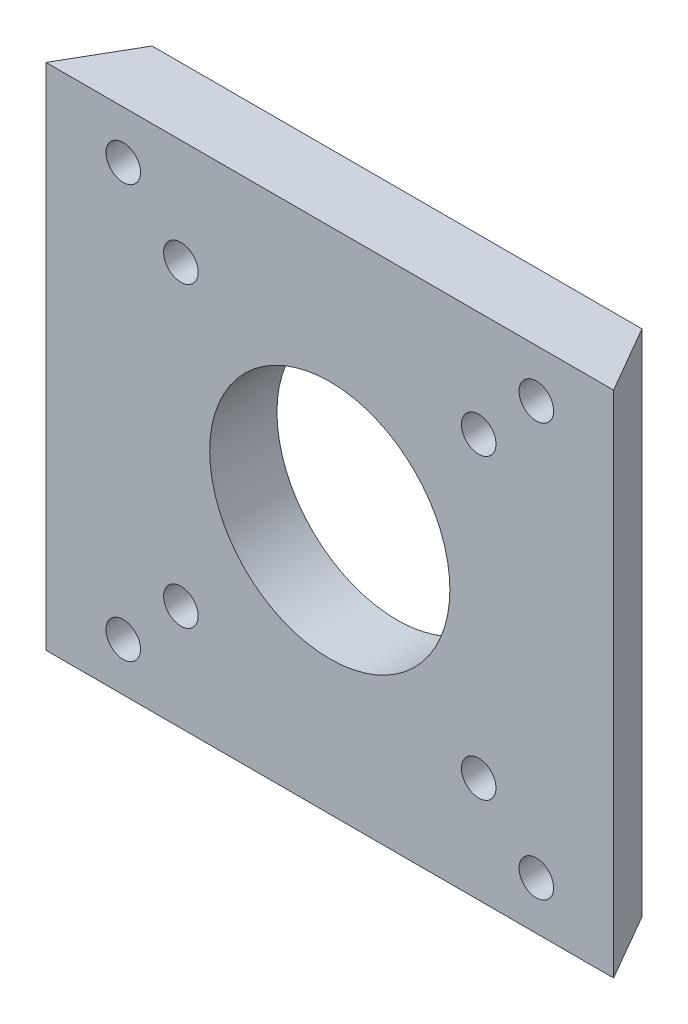
ISO-10303-21;
HEADER;
FILE_DESCRIPTION(('STEP AP214'),'2;1');
FILE_NAME('part.step','',(''),(''),'','','');
FILE_SCHEMA(('AUTOMOTIVE_DESIGN { 1 0 10303 214 1 1 1 1 }'));
ENDSEC;
DATA;
#1=APPLICATION_CONTEXT('core data for automotive mechanical design processes');
#2=APPLICATION_PROTOCOL_DEFINITION('international standard','automotive_design',2000,#1);
#3=PRODUCT_CONTEXT('',#1,'mechanical');
#4=PRODUCT('Part','Part','',(#3));
#5=PRODUCT_RELATED_PRODUCT_CATEGORY('part','',(#4));
#6=PRODUCT_DEFINITION_FORMATION('','',#4);
#7=PRODUCT_DEFINITION_CONTEXT('part definition',#1,'design');
#8=PRODUCT_DEFINITION('design','',#6,#7);
#9=PRODUCT_DEFINITION_SHAPE('','',#8);
#10=(LENGTH_UNIT() NAMED_UNIT(*) SI_UNIT(.MILLI.,.METRE.));
#11=(NAMED_UNIT(*) PLANE_ANGLE_UNIT() SI_UNIT($,.RADIAN.));
#12=(NAMED_UNIT(*) SI_UNIT($,.STERADIAN.) SOLID_ANGLE_UNIT());
#13=UNCERTAINTY_MEASURE_WITH_UNIT(LENGTH_MEASURE(1.E-05),#10,'distance_accuracy_value','');
#14=(GEOMETRIC_REPRESENTATION_CONTEXT(3) GLOBAL_UNCERTAINTY_ASSIGNED_CONTEXT((#13)) GLOBAL_UNIT_ASSIGNED_CONTEXT((#10,
#11,#12)) REPRESENTATION_CONTEXT('',''));
#15=CARTESIAN_POINT('',(0.,0.,0.));
#16=DIRECTION('',(0.,0.,1.));
#17=DIRECTION('',(1.,0.,0.));
#18=AXIS2_PLACEMENT_3D('',#15,#16,#17);
#19=CARTESIAN_POINT('',(-15.5,15.5,-3.));
#20=DIRECTION('',(0.,0.,1.));
#21=DIRECTION('',(1.,0.,0.));
#22=AXIS2_PLACEMENT_3D('',#19,#20,#21);
#23=CYLINDRICAL_SURFACE('',#22,1.8);
#24=CARTESIAN_POINT('',(-15.5,15.5,7.));
#25=DIRECTION('',(0.,0.,1.));
#26=DIRECTION('',(1.,0.,0.));
#27=AXIS2_PLACEMENT_3D('',#24,#25,#26);
#28=CIRCLE('',#27,1.8);
#29=CARTESIAN_POINT('',(-13.7,15.5,7.));
#30=VERTEX_POINT('',#29);
#31=EDGE_CURVE('E120',#30,#30,#28,.T.);
#32=ORIENTED_EDGE('',*,*,#31,.T.);
#33=EDGE_LOOP('',(#32));
#34=FACE_BOUND('',#33,.T.);
#35=CARTESIAN_POINT('',(-15.5,15.5,4.));
#36=DIRECTION('',(0.,0.,-1.));
#37=DIRECTION('',(-1.,0.,0.));
#38=AXIS2_PLACEMENT_3D('',#35,#36,#37);
#39=CIRCLE('',#38,1.8);
#40=CARTESIAN_POINT('',(-17.3,15.5,4.));
#41=VERTEX_POINT('',#40);
#42=EDGE_CURVE('E37',#41,#41,#39,.F.);
#43=ORIENTED_EDGE('',*,*,#42,.F.);
#44=EDGE_LOOP('',(#43));
#45=FACE_BOUND('',#44,.T.);
#46=ADVANCED_FACE('F33',(#34,#45),#23,.F.);
#47=CARTESIAN_POINT('',(15.5,15.5,-3.));
#48=DIRECTION('',(0.,0.,1.));
#49=DIRECTION('',(1.,0.,0.));
#50=AXIS2_PLACEMENT_3D('',#47,#48,#49);
#51=CYLINDRICAL_SURFACE('',#50,1.8);
#52=CARTESIAN_POINT('',(15.5,15.5,7.));
#53=DIRECTION('',(0.,0.,1.));
#54=DIRECTION('',(1.,0.,0.));
#55=AXIS2_PLACEMENT_3D('',#52,#53,#54);
#56=CIRCLE('',#55,1.8);
#57=CARTESIAN_POINT('',(17.3,15.5,7.));
#58=VERTEX_POINT('',#57);
#59=EDGE_CURVE('E117',#58,#58,#56,.T.);
#60=ORIENTED_EDGE('',*,*,#59,.T.);
#61=EDGE_LOOP('',(#60));
#62=FACE_BOUND('',#61,.T.);
#63=CARTESIAN_POINT('',(15.5,15.5,4.));
#64=DIRECTION('',(0.,0.,-1.));
#65=DIRECTION('',(-1.,0.,0.));
#66=AXIS2_PLACEMENT_3D('',#63,#64,#65);
#67=CIRCLE('',#66,1.8);
#68=CARTESIAN_POINT('',(13.7,15.5,4.));
#69=VERTEX_POINT('',#68);
#70=EDGE_CURVE('E95',#69,#69,#67,.F.);
#71=ORIENTED_EDGE('',*,*,#70,.F.);
#72=EDGE_LOOP('',(#71));
#73=FACE_BOUND('',#72,.T.);
#74=ADVANCED_FACE('F163',(#62,#73),#51,.F.);
#75=CARTESIAN_POINT('',(15.5,-15.5,-3.));
#76=DIRECTION('',(0.,0.,1.));
#77=DIRECTION('',(1.,0.,0.));
#78=AXIS2_PLACEMENT_3D('',#75,#76,#77);
#79=CYLINDRICAL_SURFACE('',#78,1.8);
#80=CARTESIAN_POINT('',(15.5,-15.5,7.));
#81=DIRECTION('',(0.,0.,1.));
#82=DIRECTION('',(1.,0.,0.));
#83=AXIS2_PLACEMENT_3D('',#80,#81,#82);
#84=CIRCLE('',#83,1.8);
#85=CARTESIAN_POINT('',(17.3,-15.5,7.));
#86=VERTEX_POINT('',#85);
#87=EDGE_CURVE('E121',#86,#86,#84,.T.);
#88=ORIENTED_EDGE('',*,*,#87,.T.);
#89=EDGE_LOOP('',(#88));
#90=FACE_BOUND('',#89,.T.);
#91=CARTESIAN_POINT('',(15.5,-15.5,4.));
#92=DIRECTION('',(0.,0.,-1.));
#93=DIRECTION('',(-1.,0.,0.));
#94=AXIS2_PLACEMENT_3D('',#91,#92,#93);
#95=CIRCLE('',#94,1.8);
#96=CARTESIAN_POINT('',(13.7,-15.5,4.));
#97=VERTEX_POINT('',#96);
#98=EDGE_CURVE('E155',#97,#97,#95,.F.);
#99=ORIENTED_EDGE('',*,*,#98,.F.);
#100=EDGE_LOOP('',(#99));
#101=FACE_BOUND('',#100,.T.);
#102=ADVANCED_FACE('F165',(#90,#101),#79,.F.);
#103=CARTESIAN_POINT('',(-15.5,-15.5,-3.));
#104=DIRECTION('',(0.,0.,1.));
#105=DIRECTION('',(1.,0.,0.));
#106=AXIS2_PLACEMENT_3D('',#103,#104,#105);
#107=CYLINDRICAL_SURFACE('',#106,1.8);
#108=CARTESIAN_POINT('',(-15.5,-15.5,7.));
#109=DIRECTION('',(0.,0.,1.));
#110=DIRECTION('',(1.,0.,0.));
#111=AXIS2_PLACEMENT_3D('',#108,#109,#110);
#112=CIRCLE('',#111,1.8);
#113=CARTESIAN_POINT('',(-13.7,-15.5,7.));
#114=VERTEX_POINT('',#113);
#115=EDGE_CURVE('E124',#114,#114,#112,.T.);
#116=ORIENTED_EDGE('',*,*,#115,.T.);
#117=EDGE_LOOP('',(#116));
#118=FACE_BOUND('',#117,.T.);
#119=CARTESIAN_POINT('',(-15.5,-15.5,4.));
#120=DIRECTION('',(0.,0.,-1.));
#121=DIRECTION('',(-1.,0.,0.));
#122=AXIS2_PLACEMENT_3D('',#119,#120,#121);
#123=CIRCLE('',#122,1.8);
#124=CARTESIAN_POINT('',(-17.3,-15.5,4.));
#125=VERTEX_POINT('',#124);
#126=EDGE_CURVE('E152',#125,#125,#123,.F.);
#127=ORIENTED_EDGE('',*,*,#126,.F.);
#128=EDGE_LOOP('',(#127));
#129=FACE_BOUND('',#128,.T.);
#130=ADVANCED_FACE('F172',(#118,#129),#107,.F.);
#131=CARTESIAN_POINT('',(-25.5,26.5,7.));
#132=DIRECTION('',(0.,-1.,0.));
#133=DIRECTION('',(0.,0.,-1.));
#134=AXIS2_PLACEMENT_3D('',#131,#132,#133);
#135=PLANE('',#134);
#136=DIRECTION('',(-1.,0.,0.));
#137=VECTOR('',#136,1.);
#138=CARTESIAN_POINT('',(-25.5,26.5,0.));
#139=LINE('',#138,#137);
#140=CARTESIAN_POINT('',(25.5,26.5,0.));
#141=VERTEX_POINT('',#140);
#142=CARTESIAN_POINT('',(-25.5,26.5,0.));
#143=VERTEX_POINT('',#142);
#144=EDGE_CURVE('E55',#141,#143,#139,.T.);
#145=ORIENTED_EDGE('',*,*,#144,.T.);
#146=DIRECTION('',(-0.500000000000003,0.,0.866025403784437));
#147=VECTOR('',#146,1.);
#148=CARTESIAN_POINT('',(-29.5414518843274,26.5,7.));
#149=LINE('',#148,#147);
#150=CARTESIAN_POINT('',(-29.5414518843274,26.5,7.));
#151=VERTEX_POINT('',#150);
#152=EDGE_CURVE('E78',#143,#151,#149,.T.);
#153=ORIENTED_EDGE('',*,*,#152,.T.);
#154=DIRECTION('',(-1.,0.,0.));
#155=VECTOR('',#154,1.);
#156=CARTESIAN_POINT('',(-25.5,26.5,7.));
#157=LINE('',#156,#155);
#158=CARTESIAN_POINT('',(29.5414518843274,26.5,7.));
#159=VERTEX_POINT('',#158);
#160=EDGE_CURVE('E42',#159,#151,#157,.T.);
#161=ORIENTED_EDGE('',*,*,#160,.F.);
#162=DIRECTION('',(-0.500000000000005,0.,-0.866025403784436));
#163=VECTOR('',#162,1.);
#164=CARTESIAN_POINT('',(29.5414518843274,26.5,7.));
#165=LINE('',#164,#163);
#166=EDGE_CURVE('E76',#159,#141,#165,.T.);
#167=ORIENTED_EDGE('',*,*,#166,.T.);
#168=EDGE_LOOP('',(#145,#153,#161,#167));
#169=FACE_BOUND('',#168,.T.);
#170=ADVANCED_FACE('F35',(#169),#135,.F.);
#171=CARTESIAN_POINT('',(-25.5,-26.5,7.));
#172=DIRECTION('',(0.,1.,0.));
#173=DIRECTION('',(0.,0.,1.));
#174=AXIS2_PLACEMENT_3D('',#171,#172,#173);
#175=PLANE('',#174);
#176=DIRECTION('',(1.,0.,0.));
#177=VECTOR('',#176,1.);
#178=CARTESIAN_POINT('',(-25.5,-26.5,0.));
#179=LINE('',#178,#177);
#180=CARTESIAN_POINT('',(-25.5,-26.5,0.));
#181=VERTEX_POINT('',#180);
#182=CARTESIAN_POINT('',(25.5,-26.5,0.));
#183=VERTEX_POINT('',#182);
#184=EDGE_CURVE('E50',#181,#183,#179,.T.);
#185=ORIENTED_EDGE('',*,*,#184,.T.);
#186=DIRECTION('',(0.500000000000005,0.,0.866025403784436));
#187=VECTOR('',#186,1.);
#188=CARTESIAN_POINT('',(29.5414518843274,-26.5,7.));
#189=LINE('',#188,#187);
#190=CARTESIAN_POINT('',(29.5414518843274,-26.5,7.));
#191=VERTEX_POINT('',#190);
#192=EDGE_CURVE('E89',#183,#191,#189,.T.);
#193=ORIENTED_EDGE('',*,*,#192,.T.);
#194=DIRECTION('',(1.,0.,0.));
#195=VECTOR('',#194,1.);
#196=CARTESIAN_POINT('',(-25.5,-26.5,7.));
#197=LINE('',#196,#195);
#198=CARTESIAN_POINT('',(-29.5414518843274,-26.5,7.));
#199=VERTEX_POINT('',#198);
#200=EDGE_CURVE('E11',#199,#191,#197,.T.);
#201=ORIENTED_EDGE('',*,*,#200,.F.);
#202=DIRECTION('',(0.500000000000003,0.,-0.866025403784437));
#203=VECTOR('',#202,1.);
#204=CARTESIAN_POINT('',(-29.5414518843274,-26.5,7.));
#205=LINE('',#204,#203);
#206=EDGE_CURVE('E102',#199,#181,#205,.T.);
#207=ORIENTED_EDGE('',*,*,#206,.T.);
#208=EDGE_LOOP('',(#185,#193,#201,#207));
#209=FACE_BOUND('',#208,.T.);
#210=ADVANCED_FACE('F191',(#209),#175,.F.);
#211=CARTESIAN_POINT('',(0.,0.,7.));
#212=DIRECTION('',(0.,0.,-1.));
#213=DIRECTION('',(-1.,0.,0.));
#214=AXIS2_PLACEMENT_3D('',#211,#212,#213);
#215=PLANE('',#214);
#216=CARTESIAN_POINT('',(-21.5,-21.5,7.));
#217=DIRECTION('',(0.,0.,1.));
#218=DIRECTION('',(1.,0.,0.));
#219=AXIS2_PLACEMENT_3D('',#216,#217,#218);
#220=CIRCLE('',#219,1.8);
#221=CARTESIAN_POINT('',(-19.7,-21.5,7.));
#222=VERTEX_POINT('',#221);
#223=EDGE_CURVE('E104',#222,#222,#220,.T.);
#224=ORIENTED_EDGE('',*,*,#223,.F.);
#225=EDGE_LOOP('',(#224));
#226=FACE_BOUND('',#225,.T.);
#227=CARTESIAN_POINT('',(21.5,-21.5,7.));
#228=DIRECTION('',(0.,0.,1.));
#229=DIRECTION('',(1.,0.,0.));
#230=AXIS2_PLACEMENT_3D('',#227,#228,#229);
#231=CIRCLE('',#230,1.8);
#232=CARTESIAN_POINT('',(23.3,-21.5,7.));
#233=VERTEX_POINT('',#232);
#234=EDGE_CURVE('E109',#233,#233,#231,.T.);
#235=ORIENTED_EDGE('',*,*,#234,.F.);
#236=EDGE_LOOP('',(#235));
#237=FACE_BOUND('',#236,.T.);
#238=CARTESIAN_POINT('',(21.5,21.5,7.));
#239=DIRECTION('',(0.,0.,1.));
#240=DIRECTION('',(1.,0.,0.));
#241=AXIS2_PLACEMENT_3D('',#238,#239,#240);
#242=CIRCLE('',#241,1.8);
#243=CARTESIAN_POINT('',(23.3,21.5,7.));
#244=VERTEX_POINT('',#243);
#245=EDGE_CURVE('E105',#244,#244,#242,.T.);
#246=ORIENTED_EDGE('',*,*,#245,.F.);
#247=EDGE_LOOP('',(#246));
#248=FACE_BOUND('',#247,.T.);
#249=CARTESIAN_POINT('',(-21.5,21.5,7.));
#250=DIRECTION('',(0.,0.,1.));
#251=DIRECTION('',(1.,0.,0.));
#252=AXIS2_PLACEMENT_3D('',#249,#250,#251);
#253=CIRCLE('',#252,1.8);
#254=CARTESIAN_POINT('',(-19.7,21.5,7.));
#255=VERTEX_POINT('',#254);
#256=EDGE_CURVE('E108',#255,#255,#253,.T.);
#257=ORIENTED_EDGE('',*,*,#256,.F.);
#258=EDGE_LOOP('',(#257));
#259=FACE_BOUND('',#258,.T.);
#260=ORIENTED_EDGE('',*,*,#115,.F.);
#261=EDGE_LOOP('',(#260));
#262=FACE_BOUND('',#261,.T.);
#263=ORIENTED_EDGE('',*,*,#87,.F.);
#264=EDGE_LOOP('',(#263));
#265=FACE_BOUND('',#264,.T.);
#266=ORIENTED_EDGE('',*,*,#59,.F.);
#267=EDGE_LOOP('',(#266));
#268=FACE_BOUND('',#267,.T.);
#269=ORIENTED_EDGE('',*,*,#31,.F.);
#270=EDGE_LOOP('',(#269));
#271=FACE_BOUND('',#270,.T.);
#272=CARTESIAN_POINT('',(0.,0.,7.));
#273=DIRECTION('',(0.,0.,1.));
#274=DIRECTION('',(1.,0.,0.));
#275=AXIS2_PLACEMENT_3D('',#272,#273,#274);
#276=CIRCLE('',#275,12.5);
#277=CARTESIAN_POINT('',(12.5,0.,7.));
#278=VERTEX_POINT('',#277);
#279=EDGE_CURVE('E130',#278,#278,#276,.T.);
#280=ORIENTED_EDGE('',*,*,#279,.F.);
#281=EDGE_LOOP('',(#280));
#282=FACE_BOUND('',#281,.T.);
#283=ORIENTED_EDGE('',*,*,#200,.T.);
#284=DIRECTION('',(0.,1.,0.));
#285=VECTOR('',#284,1.);
#286=CARTESIAN_POINT('',(29.5414518843274,-34.5829037686548,7.));
#287=LINE('',#286,#285);
#288=EDGE_CURVE('E84',#191,#159,#287,.T.);
#289=ORIENTED_EDGE('',*,*,#288,.T.);
#290=ORIENTED_EDGE('',*,*,#160,.T.);
#291=DIRECTION('',(0.,1.,0.));
#292=VECTOR('',#291,1.);
#293=CARTESIAN_POINT('',(-29.5414518843274,-34.5829037686548,7.));
#294=LINE('',#293,#292);
#295=EDGE_CURVE('E100',#199,#151,#294,.T.);
#296=ORIENTED_EDGE('',*,*,#295,.F.);
#297=EDGE_LOOP('',(#283,#289,#290,#296));
#298=FACE_BOUND('',#297,.T.);
#299=ADVANCED_FACE('F85',(#226,#237,#248,#259,#262,#265,#268,#271,#282,#298),#215,.F.);
#300=CARTESIAN_POINT('',(0.,0.,0.));
#301=DIRECTION('',(0.,0.,-1.));
#302=DIRECTION('',(-1.,0.,0.));
#303=AXIS2_PLACEMENT_3D('',#300,#301,#302);
#304=PLANE('',#303);
#305=CARTESIAN_POINT('',(15.5,-15.5,0.));
#306=DIRECTION('',(0.,0.,-1.));
#307=DIRECTION('',(-1.,0.,0.));
#308=AXIS2_PLACEMENT_3D('',#305,#306,#307);
#309=CIRCLE('',#308,4.);
#310=CARTESIAN_POINT('',(11.5,-15.5,0.));
#311=VERTEX_POINT('',#310);
#312=EDGE_CURVE('E287',#311,#311,#309,.T.);
#313=ORIENTED_EDGE('',*,*,#312,.F.);
#314=EDGE_LOOP('',(#313));
#315=FACE_BOUND('',#314,.T.);
#316=CARTESIAN_POINT('',(-15.5,-15.5,0.));
#317=DIRECTION('',(0.,0.,-1.));
#318=DIRECTION('',(-1.,0.,0.));
#319=AXIS2_PLACEMENT_3D('',#316,#317,#318);
#320=CIRCLE('',#319,4.);
#321=CARTESIAN_POINT('',(-19.5,-15.5,0.));
#322=VERTEX_POINT('',#321);
#323=EDGE_CURVE('E293',#322,#322,#320,.T.);
#324=ORIENTED_EDGE('',*,*,#323,.F.);
#325=EDGE_LOOP('',(#324));
#326=FACE_BOUND('',#325,.T.);
#327=CARTESIAN_POINT('',(-15.5,15.5,0.));
#328=DIRECTION('',(0.,0.,-1.));
#329=DIRECTION('',(-1.,0.,0.));
#330=AXIS2_PLACEMENT_3D('',#327,#328,#329);
#331=CIRCLE('',#330,4.);
#332=CARTESIAN_POINT('',(-19.5,15.5,0.));
#333=VERTEX_POINT('',#332);
#334=EDGE_CURVE('E299',#333,#333,#331,.T.);
#335=ORIENTED_EDGE('',*,*,#334,.F.);
#336=EDGE_LOOP('',(#335));
#337=FACE_BOUND('',#336,.T.);
#338=CARTESIAN_POINT('',(15.5,15.5,0.));
#339=DIRECTION('',(0.,0.,-1.));
#340=DIRECTION('',(-1.,0.,0.));
#341=AXIS2_PLACEMENT_3D('',#338,#339,#340);
#342=CIRCLE('',#341,4.);
#343=CARTESIAN_POINT('',(11.5,15.5,0.));
#344=VERTEX_POINT('',#343);
#345=EDGE_CURVE('E282',#344,#344,#342,.T.);
#346=ORIENTED_EDGE('',*,*,#345,.F.);
#347=EDGE_LOOP('',(#346));
#348=FACE_BOUND('',#347,.T.);
#349=CARTESIAN_POINT('',(-21.5,-21.5,0.));
#350=DIRECTION('',(0.,0.,-1.));
#351=DIRECTION('',(-1.,0.,0.));
#352=AXIS2_PLACEMENT_3D('',#349,#350,#351);
#353=CIRCLE('',#352,1.8);
#354=CARTESIAN_POINT('',(-23.3,-21.5,0.));
#355=VERTEX_POINT('',#354);
#356=EDGE_CURVE('E127',#355,#355,#353,.T.);
#357=ORIENTED_EDGE('',*,*,#356,.F.);
#358=EDGE_LOOP('',(#357));
#359=FACE_BOUND('',#358,.T.);
#360=CARTESIAN_POINT('',(21.5,-21.5,0.));
#361=DIRECTION('',(0.,0.,-1.));
#362=DIRECTION('',(-1.,0.,0.));
#363=AXIS2_PLACEMENT_3D('',#360,#361,#362);
#364=CIRCLE('',#363,1.8);
#365=CARTESIAN_POINT('',(19.7,-21.5,0.));
#366=VERTEX_POINT('',#365);
#367=EDGE_CURVE('E147',#366,#366,#364,.T.);
#368=ORIENTED_EDGE('',*,*,#367,.F.);
#369=EDGE_LOOP('',(#368));
#370=FACE_BOUND('',#369,.T.);
#371=CARTESIAN_POINT('',(21.5,21.5,0.));
#372=DIRECTION('',(0.,0.,-1.));
#373=DIRECTION('',(-1.,0.,0.));
#374=AXIS2_PLACEMENT_3D('',#371,#372,#373);
#375=CIRCLE('',#374,1.8);
#376=CARTESIAN_POINT('',(19.7,21.5,0.));
#377=VERTEX_POINT('',#376);
#378=EDGE_CURVE('E144',#377,#377,#375,.T.);
#379=ORIENTED_EDGE('',*,*,#378,.F.);
#380=EDGE_LOOP('',(#379));
#381=FACE_BOUND('',#380,.T.);
#382=CARTESIAN_POINT('',(-21.5,21.5,0.));
#383=DIRECTION('',(0.,0.,-1.));
#384=DIRECTION('',(-1.,0.,0.));
#385=AXIS2_PLACEMENT_3D('',#382,#383,#384);
#386=CIRCLE('',#385,1.8);
#387=CARTESIAN_POINT('',(-23.3,21.5,0.));
#388=VERTEX_POINT('',#387);
#389=EDGE_CURVE('E116',#388,#388,#386,.T.);
#390=ORIENTED_EDGE('',*,*,#389,.F.);
#391=EDGE_LOOP('',(#390));
#392=FACE_BOUND('',#391,.T.);
#393=CARTESIAN_POINT('',(0.,0.,0.));
#394=DIRECTION('',(0.,0.,-1.));
#395=DIRECTION('',(-1.,0.,0.));
#396=AXIS2_PLACEMENT_3D('',#393,#394,#395);
#397=CIRCLE('',#396,12.5);
#398=CARTESIAN_POINT('',(-12.5,0.,0.));
#399=VERTEX_POINT('',#398);
#400=EDGE_CURVE('E132',#399,#399,#397,.F.);
#401=ORIENTED_EDGE('',*,*,#400,.T.);
#402=EDGE_LOOP('',(#401));
#403=FACE_BOUND('',#402,.T.);
#404=DIRECTION('',(0.,1.,0.));
#405=VECTOR('',#404,1.);
#406=CARTESIAN_POINT('',(25.5,-26.5,0.));
#407=LINE('',#406,#405);
#408=EDGE_CURVE('E92',#183,#141,#407,.T.);
#409=ORIENTED_EDGE('',*,*,#408,.F.);
#410=ORIENTED_EDGE('',*,*,#184,.F.);
#411=DIRECTION('',(0.,-1.,0.));
#412=VECTOR('',#411,1.);
#413=CARTESIAN_POINT('',(-25.5,-26.5,0.));
#414=LINE('',#413,#412);
#415=EDGE_CURVE('E136',#143,#181,#414,.T.);
#416=ORIENTED_EDGE('',*,*,#415,.F.);
#417=ORIENTED_EDGE('',*,*,#144,.F.);
#418=EDGE_LOOP('',(#409,#410,#416,#417));
#419=FACE_BOUND('',#418,.T.);
#420=ADVANCED_FACE('F187',(#315,#326,#337,#348,#359,#370,#381,#392,#403,#419),#304,.T.);
#421=CARTESIAN_POINT('',(0.,0.,7.));
#422=DIRECTION('',(0.,0.,-1.));
#423=DIRECTION('',(-1.,0.,0.));
#424=AXIS2_PLACEMENT_3D('',#421,#422,#423);
#425=CYLINDRICAL_SURFACE('',#424,12.5);
#426=ORIENTED_EDGE('',*,*,#400,.F.);
#427=EDGE_LOOP('',(#426));
#428=FACE_BOUND('',#427,.T.);
#429=ORIENTED_EDGE('',*,*,#279,.T.);
#430=EDGE_LOOP('',(#429));
#431=FACE_BOUND('',#430,.T.);
#432=ADVANCED_FACE('F184',(#428,#431),#425,.F.);
#433=CARTESIAN_POINT('',(-21.5,21.5,-4.));
#434=DIRECTION('',(0.,0.,1.));
#435=DIRECTION('',(1.,0.,0.));
#436=AXIS2_PLACEMENT_3D('',#433,#434,#435);
#437=CYLINDRICAL_SURFACE('',#436,1.8);
#438=ORIENTED_EDGE('',*,*,#389,.T.);
#439=EDGE_LOOP('',(#438));
#440=FACE_BOUND('',#439,.T.);
#441=ORIENTED_EDGE('',*,*,#256,.T.);
#442=EDGE_LOOP('',(#441));
#443=FACE_BOUND('',#442,.T.);
#444=ADVANCED_FACE('F178',(#440,#443),#437,.F.);
#445=CARTESIAN_POINT('',(21.5,21.5,-4.));
#446=DIRECTION('',(0.,0.,1.));
#447=DIRECTION('',(1.,0.,0.));
#448=AXIS2_PLACEMENT_3D('',#445,#446,#447);
#449=CYLINDRICAL_SURFACE('',#448,1.8);
#450=ORIENTED_EDGE('',*,*,#378,.T.);
#451=EDGE_LOOP('',(#450));
#452=FACE_BOUND('',#451,.T.);
#453=ORIENTED_EDGE('',*,*,#245,.T.);
#454=EDGE_LOOP('',(#453));
#455=FACE_BOUND('',#454,.T.);
#456=ADVANCED_FACE('F216',(#452,#455),#449,.F.);
#457=CARTESIAN_POINT('',(21.5,-21.5,-4.));
#458=DIRECTION('',(0.,0.,1.));
#459=DIRECTION('',(1.,0.,0.));
#460=AXIS2_PLACEMENT_3D('',#457,#458,#459);
#461=CYLINDRICAL_SURFACE('',#460,1.8);
#462=ORIENTED_EDGE('',*,*,#367,.T.);
#463=EDGE_LOOP('',(#462));
#464=FACE_BOUND('',#463,.T.);
#465=ORIENTED_EDGE('',*,*,#234,.T.);
#466=EDGE_LOOP('',(#465));
#467=FACE_BOUND('',#466,.T.);
#468=ADVANCED_FACE('F212',(#464,#467),#461,.F.);
#469=CARTESIAN_POINT('',(-21.5,-21.5,-4.));
#470=DIRECTION('',(0.,0.,1.));
#471=DIRECTION('',(1.,0.,0.));
#472=AXIS2_PLACEMENT_3D('',#469,#470,#471);
#473=CYLINDRICAL_SURFACE('',#472,1.8);
#474=ORIENTED_EDGE('',*,*,#356,.T.);
#475=EDGE_LOOP('',(#474));
#476=FACE_BOUND('',#475,.T.);
#477=ORIENTED_EDGE('',*,*,#223,.T.);
#478=EDGE_LOOP('',(#477));
#479=FACE_BOUND('',#478,.T.);
#480=ADVANCED_FACE('F204',(#476,#479),#473,.F.);
#481=CARTESIAN_POINT('',(-29.5414518843274,-34.5829037686548,7.));
#482=DIRECTION('',(-0.866025403784437,0.,-0.500000000000003));
#483=DIRECTION('',(-0.500000000000003,0.,0.866025403784437));
#484=AXIS2_PLACEMENT_3D('',#481,#482,#483);
#485=PLANE('',#484);
#486=ORIENTED_EDGE('',*,*,#206,.F.);
#487=ORIENTED_EDGE('',*,*,#295,.T.);
#488=ORIENTED_EDGE('',*,*,#152,.F.);
#489=ORIENTED_EDGE('',*,*,#415,.T.);
#490=EDGE_LOOP('',(#486,#487,#488,#489));
#491=FACE_BOUND('',#490,.T.);
#492=ADVANCED_FACE('F202',(#491),#485,.T.);
#493=CARTESIAN_POINT('',(29.5414518843274,-34.5829037686548,7.));
#494=DIRECTION('',(0.866025403784435,0.,-0.500000000000005));
#495=DIRECTION('',(-0.500000000000005,0.,-0.866025403784436));
#496=AXIS2_PLACEMENT_3D('',#493,#494,#495);
#497=PLANE('',#496);
#498=ORIENTED_EDGE('',*,*,#192,.F.);
#499=ORIENTED_EDGE('',*,*,#408,.T.);
#500=ORIENTED_EDGE('',*,*,#166,.F.);
#501=ORIENTED_EDGE('',*,*,#288,.F.);
#502=EDGE_LOOP('',(#498,#499,#500,#501));
#503=FACE_BOUND('',#502,.T.);
#504=ADVANCED_FACE('F91',(#503),#497,.T.);
#505=CARTESIAN_POINT('',(-15.5,-15.5,4.));
#506=DIRECTION('',(0.,0.,-1.));
#507=DIRECTION('',(-1.,0.,0.));
#508=AXIS2_PLACEMENT_3D('',#505,#506,#507);
#509=PLANE('',#508);
#510=CARTESIAN_POINT('',(-15.5,-15.5,4.));
#511=DIRECTION('',(0.,0.,-1.));
#512=DIRECTION('',(-1.,0.,0.));
#513=AXIS2_PLACEMENT_3D('',#510,#511,#512);
#514=CIRCLE('',#513,4.);
#515=CARTESIAN_POINT('',(-19.5,-15.5,4.));
#516=VERTEX_POINT('',#515);
#517=EDGE_CURVE('E296',#516,#516,#514,.T.);
#518=ORIENTED_EDGE('',*,*,#517,.T.);
#519=EDGE_LOOP('',(#518));
#520=FACE_BOUND('',#519,.T.);
#521=ORIENTED_EDGE('',*,*,#126,.T.);
#522=EDGE_LOOP('',(#521));
#523=FACE_BOUND('',#522,.T.);
#524=ADVANCED_FACE('F210',(#520,#523),#509,.T.);
#525=CARTESIAN_POINT('',(-15.5,-15.5,4.));
#526=DIRECTION('',(0.,0.,-1.));
#527=DIRECTION('',(-1.,0.,0.));
#528=AXIS2_PLACEMENT_3D('',#525,#526,#527);
#529=CYLINDRICAL_SURFACE('',#528,4.);
#530=ORIENTED_EDGE('',*,*,#517,.F.);
#531=EDGE_LOOP('',(#530));
#532=FACE_BOUND('',#531,.T.);
#533=ORIENTED_EDGE('',*,*,#323,.T.);
#534=EDGE_LOOP('',(#533));
#535=FACE_BOUND('',#534,.T.);
#536=ADVANCED_FACE('F263',(#532,#535),#529,.F.);
#537=CARTESIAN_POINT('',(15.5,-15.5,4.));
#538=DIRECTION('',(0.,0.,-1.));
#539=DIRECTION('',(-1.,0.,0.));
#540=AXIS2_PLACEMENT_3D('',#537,#538,#539);
#541=PLANE('',#540);
#542=CARTESIAN_POINT('',(15.5,-15.5,4.));
#543=DIRECTION('',(0.,0.,-1.));
#544=DIRECTION('',(-1.,0.,0.));
#545=AXIS2_PLACEMENT_3D('',#542,#543,#544);
#546=CIRCLE('',#545,4.);
#547=CARTESIAN_POINT('',(11.5,-15.5,4.));
#548=VERTEX_POINT('',#547);
#549=EDGE_CURVE('E290',#548,#548,#546,.T.);
#550=ORIENTED_EDGE('',*,*,#549,.T.);
#551=EDGE_LOOP('',(#550));
#552=FACE_BOUND('',#551,.T.);
#553=ORIENTED_EDGE('',*,*,#98,.T.);
#554=EDGE_LOOP('',(#553));
#555=FACE_BOUND('',#554,.T.);
#556=ADVANCED_FACE('F267',(#552,#555),#541,.T.);
#557=CARTESIAN_POINT('',(15.5,-15.5,4.));
#558=DIRECTION('',(0.,0.,-1.));
#559=DIRECTION('',(-1.,0.,0.));
#560=AXIS2_PLACEMENT_3D('',#557,#558,#559);
#561=CYLINDRICAL_SURFACE('',#560,4.);
#562=ORIENTED_EDGE('',*,*,#549,.F.);
#563=EDGE_LOOP('',(#562));
#564=FACE_BOUND('',#563,.T.);
#565=ORIENTED_EDGE('',*,*,#312,.T.);
#566=EDGE_LOOP('',(#565));
#567=FACE_BOUND('',#566,.T.);
#568=ADVANCED_FACE('F271',(#564,#567),#561,.F.);
#569=CARTESIAN_POINT('',(15.5,15.5,4.));
#570=DIRECTION('',(0.,0.,-1.));
#571=DIRECTION('',(-1.,0.,0.));
#572=AXIS2_PLACEMENT_3D('',#569,#570,#571);
#573=PLANE('',#572);
#574=CARTESIAN_POINT('',(15.5,15.5,4.));
#575=DIRECTION('',(0.,0.,-1.));
#576=DIRECTION('',(-1.,0.,0.));
#577=AXIS2_PLACEMENT_3D('',#574,#575,#576);
#578=CIRCLE('',#577,4.);
#579=CARTESIAN_POINT('',(11.5,15.5,4.));
#580=VERTEX_POINT('',#579);
#581=EDGE_CURVE('E156',#580,#580,#578,.T.);
#582=ORIENTED_EDGE('',*,*,#581,.T.);
#583=EDGE_LOOP('',(#582));
#584=FACE_BOUND('',#583,.T.);
#585=ORIENTED_EDGE('',*,*,#70,.T.);
#586=EDGE_LOOP('',(#585));
#587=FACE_BOUND('',#586,.T.);
#588=ADVANCED_FACE('F161',(#584,#587),#573,.T.);
#589=CARTESIAN_POINT('',(15.5,15.5,4.));
#590=DIRECTION('',(0.,0.,-1.));
#591=DIRECTION('',(-1.,0.,0.));
#592=AXIS2_PLACEMENT_3D('',#589,#590,#591);
#593=CYLINDRICAL_SURFACE('',#592,4.);
#594=ORIENTED_EDGE('',*,*,#581,.F.);
#595=EDGE_LOOP('',(#594));
#596=FACE_BOUND('',#595,.T.);
#597=ORIENTED_EDGE('',*,*,#345,.T.);
#598=EDGE_LOOP('',(#597));
#599=FACE_BOUND('',#598,.T.);
#600=ADVANCED_FACE('F249',(#596,#599),#593,.F.);
#601=CARTESIAN_POINT('',(-15.5,15.5,4.));
#602=DIRECTION('',(0.,0.,-1.));
#603=DIRECTION('',(-1.,0.,0.));
#604=AXIS2_PLACEMENT_3D('',#601,#602,#603);
#605=PLANE('',#604);
#606=CARTESIAN_POINT('',(-15.5,15.5,4.));
#607=DIRECTION('',(0.,0.,-1.));
#608=DIRECTION('',(-1.,0.,0.));
#609=AXIS2_PLACEMENT_3D('',#606,#607,#608);
#610=CIRCLE('',#609,4.);
#611=CARTESIAN_POINT('',(-19.5,15.5,4.));
#612=VERTEX_POINT('',#611);
#613=EDGE_CURVE('E285',#612,#612,#610,.T.);
#614=ORIENTED_EDGE('',*,*,#613,.T.);
#615=EDGE_LOOP('',(#614));
#616=FACE_BOUND('',#615,.T.);
#617=ORIENTED_EDGE('',*,*,#42,.T.);
#618=EDGE_LOOP('',(#617));
#619=FACE_BOUND('',#618,.T.);
#620=ADVANCED_FACE('F246',(#616,#619),#605,.T.);
#621=CARTESIAN_POINT('',(-15.5,15.5,4.));
#622=DIRECTION('',(0.,0.,-1.));
#623=DIRECTION('',(-1.,0.,0.));
#624=AXIS2_PLACEMENT_3D('',#621,#622,#623);
#625=CYLINDRICAL_SURFACE('',#624,4.);
#626=ORIENTED_EDGE('',*,*,#613,.F.);
#627=EDGE_LOOP('',(#626));
#628=FACE_BOUND('',#627,.T.);
#629=ORIENTED_EDGE('',*,*,#334,.T.);
#630=EDGE_LOOP('',(#629));
#631=FACE_BOUND('',#630,.T.);
#632=ADVANCED_FACE('F248',(#628,#631),#625,.F.);
#633=CLOSED_SHELL('',(#46,#74,#102,#130,#170,#210,#299,#420,#432,#444,#456,#468,#480,#492,#504,
#524,#536,#556,#568,#588,#600,#620,#632));
#634=MANIFOLD_SOLID_BREP('B2',#633);
#635=ADVANCED_BREP_SHAPE_REPRESENTATION('',(#18,#634),#14);
#636=SHAPE_DEFINITION_REPRESENTATION(#9,#635);
ENDSEC;
END-ISO-10303-21;
